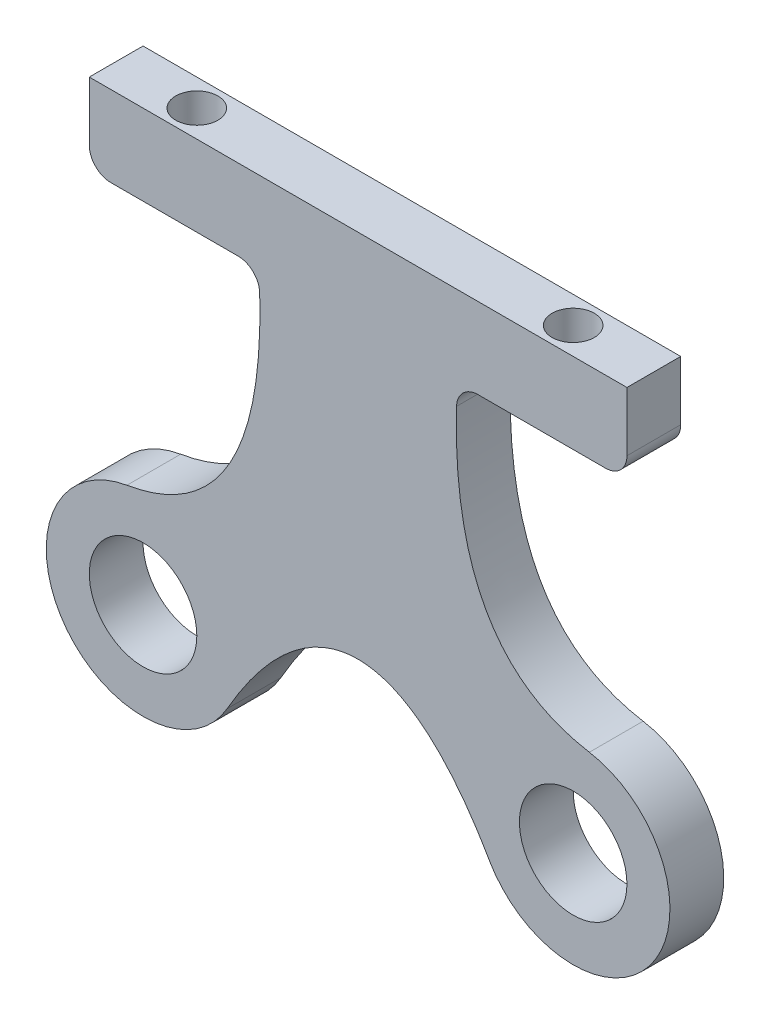
ISO-10303-21;
HEADER;
FILE_DESCRIPTION(('STEP AP214'),'2;1');
FILE_NAME('part.step','',(''),(''),'','','');
FILE_SCHEMA(('AUTOMOTIVE_DESIGN { 1 0 10303 214 1 1 1 1 }'));
ENDSEC;
DATA;
#1=APPLICATION_CONTEXT('core data for automotive mechanical design processes');
#2=APPLICATION_PROTOCOL_DEFINITION('international standard','automotive_design',2000,#1);
#3=PRODUCT_CONTEXT('',#1,'mechanical');
#4=PRODUCT('Part','Part','',(#3));
#5=PRODUCT_RELATED_PRODUCT_CATEGORY('part','',(#4));
#6=PRODUCT_DEFINITION_FORMATION('','',#4);
#7=PRODUCT_DEFINITION_CONTEXT('part definition',#1,'design');
#8=PRODUCT_DEFINITION('design','',#6,#7);
#9=PRODUCT_DEFINITION_SHAPE('','',#8);
#10=(LENGTH_UNIT() NAMED_UNIT(*) SI_UNIT(.MILLI.,.METRE.));
#11=(NAMED_UNIT(*) PLANE_ANGLE_UNIT() SI_UNIT($,.RADIAN.));
#12=(NAMED_UNIT(*) SI_UNIT($,.STERADIAN.) SOLID_ANGLE_UNIT());
#13=UNCERTAINTY_MEASURE_WITH_UNIT(LENGTH_MEASURE(1.E-05),#10,'distance_accuracy_value','');
#14=(GEOMETRIC_REPRESENTATION_CONTEXT(3) GLOBAL_UNCERTAINTY_ASSIGNED_CONTEXT((#13)) GLOBAL_UNIT_ASSIGNED_CONTEXT((#10,
#11,#12)) REPRESENTATION_CONTEXT('',''));
#15=CARTESIAN_POINT('',(0.,0.,0.));
#16=DIRECTION('',(0.,0.,1.));
#17=DIRECTION('',(1.,0.,0.));
#18=AXIS2_PLACEMENT_3D('',#15,#16,#17);
#19=CARTESIAN_POINT('',(-15.4784384659952,-56.4751666695311,3.175));
#20=CARTESIAN_POINT('',(-5.06783039272914,-38.2749102506567,3.175));
#21=CARTESIAN_POINT('',(6.38081654035735,-40.5703270402513,3.175));
#22=CARTESIAN_POINT('',(15.4784384659952,-56.4751666695311,3.175));
#23=B_SPLINE_CURVE_WITH_KNOTS('',3,(#19,#20,#21,#22),.UNSPECIFIED.,.F.,.F.,(4,4),(0.,1.),.UNSPECIFIED.);
#24=DIRECTION('',(0.,0.,-1.));
#25=VECTOR('',#24,1.);
#26=SURFACE_OF_LINEAR_EXTRUSION('',#23,#25);
#27=CARTESIAN_POINT('',(-15.4784384659952,-56.4751666695311,-3.175));
#28=CARTESIAN_POINT('',(-5.06783039272914,-38.2749102506567,-3.175));
#29=CARTESIAN_POINT('',(6.38081654035735,-40.5703270402513,-3.175));
#30=CARTESIAN_POINT('',(15.4784384659952,-56.4751666695311,-3.175));
#31=B_SPLINE_CURVE_WITH_KNOTS('',3,(#27,#28,#29,#30),.UNSPECIFIED.,.F.,.F.,(4,4),(0.,1.),.UNSPECIFIED.);
#32=CARTESIAN_POINT('',(-15.4784384659952,-56.4751666695311,-3.175));
#33=VERTEX_POINT('',#32);
#34=CARTESIAN_POINT('',(15.4784384659952,-56.4751666695311,-3.175));
#35=VERTEX_POINT('',#34);
#36=EDGE_CURVE('E162',#33,#35,#31,.T.);
#37=ORIENTED_EDGE('',*,*,#36,.T.);
#38=DIRECTION('',(0.,0.,-1.));
#39=VECTOR('',#38,1.);
#40=CARTESIAN_POINT('',(15.4784384659952,-56.4751666695311,3.175));
#41=LINE('',#40,#39);
#42=CARTESIAN_POINT('',(15.4784384659952,-56.4751666695311,3.175));
#43=VERTEX_POINT('',#42);
#44=EDGE_CURVE('E141',#43,#35,#41,.T.);
#45=ORIENTED_EDGE('',*,*,#44,.F.);
#46=CARTESIAN_POINT('',(-15.4784384659952,-56.4751666695311,3.175));
#47=VERTEX_POINT('',#46);
#48=EDGE_CURVE('E148',#47,#43,#23,.T.);
#49=ORIENTED_EDGE('',*,*,#48,.F.);
#50=DIRECTION('',(0.,0.,-1.));
#51=VECTOR('',#50,1.);
#52=CARTESIAN_POINT('',(-15.4784384659952,-56.4751666695311,3.175));
#53=LINE('',#52,#51);
#54=EDGE_CURVE('E311',#47,#33,#53,.T.);
#55=ORIENTED_EDGE('',*,*,#54,.T.);
#56=EDGE_LOOP('',(#37,#45,#49,#55));
#57=FACE_BOUND('',#56,.T.);
#58=ADVANCED_FACE('F35',(#57),#26,.F.);
#59=CARTESIAN_POINT('',(25.4,-50.8,3.175));
#60=DIRECTION('',(0.,0.,-1.));
#61=DIRECTION('',(-1.,0.,0.));
#62=AXIS2_PLACEMENT_3D('',#59,#60,#61);
#63=CYLINDRICAL_SURFACE('',#62,11.43);
#64=CARTESIAN_POINT('',(25.4,-50.8,-3.175));
#65=DIRECTION('',(0.,0.,1.));
#66=DIRECTION('',(1.,0.,0.));
#67=AXIS2_PLACEMENT_3D('',#64,#65,#66);
#68=CIRCLE('',#67,11.43);
#69=CARTESIAN_POINT('',(27.3097126524474,-39.5306656103795,-3.175));
#70=VERTEX_POINT('',#69);
#71=EDGE_CURVE('E327',#35,#70,#68,.T.);
#72=ORIENTED_EDGE('',*,*,#71,.T.);
#73=DIRECTION('',(0.,0.,-1.));
#74=VECTOR('',#73,1.);
#75=CARTESIAN_POINT('',(27.3097126524474,-39.5306656103795,3.175));
#76=LINE('',#75,#74);
#77=CARTESIAN_POINT('',(27.3097126524474,-39.5306656103795,3.175));
#78=VERTEX_POINT('',#77);
#79=EDGE_CURVE('E144',#78,#70,#76,.T.);
#80=ORIENTED_EDGE('',*,*,#79,.F.);
#81=CARTESIAN_POINT('',(25.4,-50.8,3.175));
#82=DIRECTION('',(0.,0.,1.));
#83=DIRECTION('',(1.,0.,0.));
#84=AXIS2_PLACEMENT_3D('',#81,#82,#83);
#85=CIRCLE('',#84,11.43);
#86=EDGE_CURVE('E137',#43,#78,#85,.T.);
#87=ORIENTED_EDGE('',*,*,#86,.F.);
#88=ORIENTED_EDGE('',*,*,#44,.T.);
#89=EDGE_LOOP('',(#72,#80,#87,#88));
#90=FACE_BOUND('',#89,.T.);
#91=ADVANCED_FACE('F139',(#90),#63,.T.);
#92=CARTESIAN_POINT('',(27.3097126524474,-39.5306656103795,3.175));
#93=CARTESIAN_POINT('',(10.1214415846719,-36.6179240413602,3.175));
#94=CARTESIAN_POINT('',(11.7360703680007,-9.52500000000001,3.175));
#95=B_SPLINE_CURVE_WITH_KNOTS('',2,(#92,#93,#94),.UNSPECIFIED.,.F.,.F.,(3,3),(0.,1.),.UNSPECIFIED.);
#96=DIRECTION('',(0.,0.,-1.));
#97=VECTOR('',#96,1.);
#98=SURFACE_OF_LINEAR_EXTRUSION('',#95,#97);
#99=CARTESIAN_POINT('',(27.3097126524474,-39.5306656103795,-3.175));
#100=CARTESIAN_POINT('',(10.1214415846719,-36.6179240413602,-3.175));
#101=CARTESIAN_POINT('',(11.7360703680007,-9.52500000000001,-3.175));
#102=B_SPLINE_CURVE_WITH_KNOTS('',2,(#99,#100,#101),.UNSPECIFIED.,.F.,.F.,(3,3),(0.,1.),.UNSPECIFIED.);
#103=CARTESIAN_POINT('',(11.6265587163297,-11.9926300390394,-3.175));
#104=VERTEX_POINT('',#103);
#105=EDGE_CURVE('E320',#70,#104,#102,.T.);
#106=ORIENTED_EDGE('',*,*,#105,.T.);
#107=DIRECTION('',(0.,0.,-1.));
#108=VECTOR('',#107,1.);
#109=CARTESIAN_POINT('',(11.6265587163297,-11.9926300390394,-3.175));
#110=LINE('',#109,#108);
#111=CARTESIAN_POINT('',(11.6265587163297,-11.9926300390394,3.175));
#112=VERTEX_POINT('',#111);
#113=EDGE_CURVE('E190',#104,#112,#110,.F.);
#114=ORIENTED_EDGE('',*,*,#113,.T.);
#115=EDGE_CURVE('E147',#78,#112,#95,.T.);
#116=ORIENTED_EDGE('',*,*,#115,.F.);
#117=ORIENTED_EDGE('',*,*,#79,.T.);
#118=EDGE_LOOP('',(#106,#114,#116,#117));
#119=FACE_BOUND('',#118,.T.);
#120=ADVANCED_FACE('F257',(#119),#98,.F.);
#121=CARTESIAN_POINT('',(0.,-9.52500000000001,3.175));
#122=DIRECTION('',(0.,-1.,0.));
#123=DIRECTION('',(0.,0.,-1.));
#124=AXIS2_PLACEMENT_3D('',#121,#122,#123);
#125=PLANE('',#124);
#126=CARTESIAN_POINT('',(22.225,-9.52500000000001,0.));
#127=DIRECTION('',(0.,-1.,0.));
#128=DIRECTION('',(0.,0.,-1.));
#129=AXIS2_PLACEMENT_3D('',#126,#127,#128);
#130=CIRCLE('',#129,2.4892);
#131=CARTESIAN_POINT('',(22.225,-9.52500000000001,-2.48919999999999));
#132=VERTEX_POINT('',#131);
#133=EDGE_CURVE('E377',#132,#132,#130,.T.);
#134=ORIENTED_EDGE('',*,*,#133,.F.);
#135=EDGE_LOOP('',(#134));
#136=FACE_BOUND('',#135,.T.);
#137=DIRECTION('',(-1.,0.,0.));
#138=VECTOR('',#137,1.);
#139=CARTESIAN_POINT('',(0.,-9.52500000000001,-3.175));
#140=LINE('',#139,#138);
#141=CARTESIAN_POINT('',(29.21,-9.52500000000001,-3.175));
#142=VERTEX_POINT('',#141);
#143=CARTESIAN_POINT('',(14.1655275205395,-9.52500000000001,-3.175));
#144=VERTEX_POINT('',#143);
#145=EDGE_CURVE('E318',#142,#144,#140,.T.);
#146=ORIENTED_EDGE('',*,*,#145,.F.);
#147=DIRECTION('',(0.,0.,-1.));
#148=VECTOR('',#147,1.);
#149=CARTESIAN_POINT('',(29.21,-9.52500000000001,3.175));
#150=LINE('',#149,#148);
#151=CARTESIAN_POINT('',(29.21,-9.52500000000001,3.175));
#152=VERTEX_POINT('',#151);
#153=EDGE_CURVE('E178',#142,#152,#150,.F.);
#154=ORIENTED_EDGE('',*,*,#153,.T.);
#155=DIRECTION('',(-1.,0.,0.));
#156=VECTOR('',#155,1.);
#157=CARTESIAN_POINT('',(0.,-9.52500000000001,3.175));
#158=LINE('',#157,#156);
#159=CARTESIAN_POINT('',(14.1655275205395,-9.52500000000001,3.175));
#160=VERTEX_POINT('',#159);
#161=EDGE_CURVE('E268',#152,#160,#158,.T.);
#162=ORIENTED_EDGE('',*,*,#161,.T.);
#163=DIRECTION('',(0.,0.,-1.));
#164=VECTOR('',#163,1.);
#165=CARTESIAN_POINT('',(14.1655275205395,-9.52500000000001,3.175));
#166=LINE('',#165,#164);
#167=EDGE_CURVE('E175',#160,#144,#166,.T.);
#168=ORIENTED_EDGE('',*,*,#167,.T.);
#169=EDGE_LOOP('',(#146,#154,#162,#168));
#170=FACE_BOUND('',#169,.T.);
#171=ADVANCED_FACE('F253',(#136,#170),#125,.T.);
#172=CARTESIAN_POINT('',(31.75,0.,3.175));
#173=DIRECTION('',(1.,0.,0.));
#174=DIRECTION('',(0.,0.,-1.));
#175=AXIS2_PLACEMENT_3D('',#172,#173,#174);
#176=PLANE('',#175);
#177=DIRECTION('',(0.,-1.,0.));
#178=VECTOR('',#177,1.);
#179=CARTESIAN_POINT('',(31.75,0.,3.175));
#180=LINE('',#179,#178);
#181=CARTESIAN_POINT('',(31.75,0.,3.175));
#182=VERTEX_POINT('',#181);
#183=CARTESIAN_POINT('',(31.75,-6.98500000000001,3.175));
#184=VERTEX_POINT('',#183);
#185=EDGE_CURVE('E274',#182,#184,#180,.T.);
#186=ORIENTED_EDGE('',*,*,#185,.T.);
#187=DIRECTION('',(0.,0.,-1.));
#188=VECTOR('',#187,1.);
#189=CARTESIAN_POINT('',(31.75,-6.98500000000001,3.175));
#190=LINE('',#189,#188);
#191=CARTESIAN_POINT('',(31.75,-6.98500000000001,-3.175));
#192=VERTEX_POINT('',#191);
#193=EDGE_CURVE('E163',#184,#192,#190,.T.);
#194=ORIENTED_EDGE('',*,*,#193,.T.);
#195=DIRECTION('',(0.,-1.,0.));
#196=VECTOR('',#195,1.);
#197=CARTESIAN_POINT('',(31.75,0.,-3.175));
#198=LINE('',#197,#196);
#199=CARTESIAN_POINT('',(31.75,0.,-3.175));
#200=VERTEX_POINT('',#199);
#201=EDGE_CURVE('E294',#200,#192,#198,.T.);
#202=ORIENTED_EDGE('',*,*,#201,.F.);
#203=DIRECTION('',(0.,0.,-1.));
#204=VECTOR('',#203,1.);
#205=CARTESIAN_POINT('',(31.75,0.,3.175));
#206=LINE('',#205,#204);
#207=EDGE_CURVE('E168',#182,#200,#206,.T.);
#208=ORIENTED_EDGE('',*,*,#207,.F.);
#209=EDGE_LOOP('',(#186,#194,#202,#208));
#210=FACE_BOUND('',#209,.T.);
#211=ADVANCED_FACE('F249',(#210),#176,.T.);
#212=CARTESIAN_POINT('',(0.,0.,3.175));
#213=DIRECTION('',(0.,-1.,0.));
#214=DIRECTION('',(0.,0.,-1.));
#215=AXIS2_PLACEMENT_3D('',#212,#213,#214);
#216=PLANE('',#215);
#217=CARTESIAN_POINT('',(-22.225,0.,0.));
#218=DIRECTION('',(0.,-1.,0.));
#219=DIRECTION('',(0.,0.,-1.));
#220=AXIS2_PLACEMENT_3D('',#217,#218,#219);
#221=CIRCLE('',#220,2.48919999999999);
#222=CARTESIAN_POINT('',(-22.225,0.,-2.48919999999999));
#223=VERTEX_POINT('',#222);
#224=EDGE_CURVE('E380',#223,#223,#221,.T.);
#225=ORIENTED_EDGE('',*,*,#224,.T.);
#226=EDGE_LOOP('',(#225));
#227=FACE_BOUND('',#226,.T.);
#228=CARTESIAN_POINT('',(22.225,0.,0.));
#229=DIRECTION('',(0.,-1.,0.));
#230=DIRECTION('',(0.,0.,-1.));
#231=AXIS2_PLACEMENT_3D('',#228,#229,#230);
#232=CIRCLE('',#231,2.48919999999999);
#233=CARTESIAN_POINT('',(22.225,0.,-2.48919999999999));
#234=VERTEX_POINT('',#233);
#235=EDGE_CURVE('E335',#234,#234,#232,.T.);
#236=ORIENTED_EDGE('',*,*,#235,.T.);
#237=EDGE_LOOP('',(#236));
#238=FACE_BOUND('',#237,.T.);
#239=DIRECTION('',(-1.,0.,0.));
#240=VECTOR('',#239,1.);
#241=CARTESIAN_POINT('',(0.,0.,-3.175));
#242=LINE('',#241,#240);
#243=CARTESIAN_POINT('',(-31.75,0.,-3.175));
#244=VERTEX_POINT('',#243);
#245=EDGE_CURVE('E292',#200,#244,#242,.T.);
#246=ORIENTED_EDGE('',*,*,#245,.T.);
#247=DIRECTION('',(0.,0.,-1.));
#248=VECTOR('',#247,1.);
#249=CARTESIAN_POINT('',(-31.75,0.,3.175));
#250=LINE('',#249,#248);
#251=CARTESIAN_POINT('',(-31.75,0.,3.175));
#252=VERTEX_POINT('',#251);
#253=EDGE_CURVE('E291',#252,#244,#250,.T.);
#254=ORIENTED_EDGE('',*,*,#253,.F.);
#255=DIRECTION('',(-1.,0.,0.));
#256=VECTOR('',#255,1.);
#257=CARTESIAN_POINT('',(0.,0.,3.175));
#258=LINE('',#257,#256);
#259=EDGE_CURVE('E277',#182,#252,#258,.T.);
#260=ORIENTED_EDGE('',*,*,#259,.F.);
#261=ORIENTED_EDGE('',*,*,#207,.T.);
#262=EDGE_LOOP('',(#246,#254,#260,#261));
#263=FACE_BOUND('',#262,.T.);
#264=ADVANCED_FACE('F245',(#227,#238,#263),#216,.F.);
#265=CARTESIAN_POINT('',(-31.75,0.,3.175));
#266=DIRECTION('',(1.,0.,0.));
#267=DIRECTION('',(0.,0.,-1.));
#268=AXIS2_PLACEMENT_3D('',#265,#266,#267);
#269=PLANE('',#268);
#270=DIRECTION('',(0.,-1.,0.));
#271=VECTOR('',#270,1.);
#272=CARTESIAN_POINT('',(-31.75,0.,-3.175));
#273=LINE('',#272,#271);
#274=CARTESIAN_POINT('',(-31.75,-6.98500000000001,-3.175));
#275=VERTEX_POINT('',#274);
#276=EDGE_CURVE('E212',#244,#275,#273,.T.);
#277=ORIENTED_EDGE('',*,*,#276,.T.);
#278=DIRECTION('',(0.,0.,-1.));
#279=VECTOR('',#278,1.);
#280=CARTESIAN_POINT('',(-31.75,-6.98500000000001,3.175));
#281=LINE('',#280,#279);
#282=CARTESIAN_POINT('',(-31.75,-6.98500000000001,3.175));
#283=VERTEX_POINT('',#282);
#284=EDGE_CURVE('E188',#275,#283,#281,.F.);
#285=ORIENTED_EDGE('',*,*,#284,.T.);
#286=DIRECTION('',(0.,-1.,0.));
#287=VECTOR('',#286,1.);
#288=CARTESIAN_POINT('',(-31.75,0.,3.175));
#289=LINE('',#288,#287);
#290=EDGE_CURVE('E222',#252,#283,#289,.T.);
#291=ORIENTED_EDGE('',*,*,#290,.F.);
#292=ORIENTED_EDGE('',*,*,#253,.T.);
#293=EDGE_LOOP('',(#277,#285,#291,#292));
#294=FACE_BOUND('',#293,.T.);
#295=ADVANCED_FACE('F241',(#294),#269,.F.);
#296=CARTESIAN_POINT('',(0.,-9.52500000000001,3.175));
#297=DIRECTION('',(0.,1.,0.));
#298=DIRECTION('',(0.,0.,1.));
#299=AXIS2_PLACEMENT_3D('',#296,#297,#298);
#300=PLANE('',#299);
#301=CARTESIAN_POINT('',(-22.225,-9.52500000000001,0.));
#302=DIRECTION('',(0.,-1.,0.));
#303=DIRECTION('',(0.,0.,-1.));
#304=AXIS2_PLACEMENT_3D('',#301,#302,#303);
#305=CIRCLE('',#304,2.4892);
#306=CARTESIAN_POINT('',(-22.225,-9.52500000000001,-2.48919999999999));
#307=VERTEX_POINT('',#306);
#308=EDGE_CURVE('E383',#307,#307,#305,.T.);
#309=ORIENTED_EDGE('',*,*,#308,.F.);
#310=EDGE_LOOP('',(#309));
#311=FACE_BOUND('',#310,.T.);
#312=DIRECTION('',(1.,0.,0.));
#313=VECTOR('',#312,1.);
#314=CARTESIAN_POINT('',(0.,-9.52500000000001,3.175));
#315=LINE('',#314,#313);
#316=CARTESIAN_POINT('',(-29.21,-9.52500000000001,3.175));
#317=VERTEX_POINT('',#316);
#318=CARTESIAN_POINT('',(-14.1655275205395,-9.52500000000001,3.175));
#319=VERTEX_POINT('',#318);
#320=EDGE_CURVE('E218',#317,#319,#315,.T.);
#321=ORIENTED_EDGE('',*,*,#320,.F.);
#322=DIRECTION('',(0.,0.,-1.));
#323=VECTOR('',#322,1.);
#324=CARTESIAN_POINT('',(-29.21,-9.52500000000001,3.175));
#325=LINE('',#324,#323);
#326=CARTESIAN_POINT('',(-29.21,-9.52500000000001,-3.175));
#327=VERTEX_POINT('',#326);
#328=EDGE_CURVE('E185',#317,#327,#325,.T.);
#329=ORIENTED_EDGE('',*,*,#328,.T.);
#330=DIRECTION('',(1.,0.,0.));
#331=VECTOR('',#330,1.);
#332=CARTESIAN_POINT('',(0.,-9.52500000000001,-3.175));
#333=LINE('',#332,#331);
#334=CARTESIAN_POINT('',(-14.1655275205395,-9.52500000000001,-3.175));
#335=VERTEX_POINT('',#334);
#336=EDGE_CURVE('E204',#327,#335,#333,.T.);
#337=ORIENTED_EDGE('',*,*,#336,.T.);
#338=DIRECTION('',(0.,0.,-1.));
#339=VECTOR('',#338,1.);
#340=CARTESIAN_POINT('',(-14.1655275205395,-9.52500000000001,3.175));
#341=LINE('',#340,#339);
#342=EDGE_CURVE('E56',#335,#319,#341,.F.);
#343=ORIENTED_EDGE('',*,*,#342,.T.);
#344=EDGE_LOOP('',(#321,#329,#337,#343));
#345=FACE_BOUND('',#344,.T.);
#346=ADVANCED_FACE('F210',(#311,#345),#300,.F.);
#347=CARTESIAN_POINT('',(-27.3097126524474,-39.5306656103795,3.175));
#348=CARTESIAN_POINT('',(-10.1214415846719,-36.6179240413602,3.175));
#349=CARTESIAN_POINT('',(-11.7360703680007,-9.52500000000001,3.175));
#350=B_SPLINE_CURVE_WITH_KNOTS('',2,(#347,#348,#349),.UNSPECIFIED.,.F.,.F.,(3,3),(0.,1.),.UNSPECIFIED.);
#351=DIRECTION('',(0.,0.,-1.));
#352=VECTOR('',#351,1.);
#353=SURFACE_OF_LINEAR_EXTRUSION('',#350,#352);
#354=CARTESIAN_POINT('',(-27.3097126524474,-39.5306656103795,3.175));
#355=VERTEX_POINT('',#354);
#356=CARTESIAN_POINT('',(-11.6265587163297,-11.9926300390394,3.175));
#357=VERTEX_POINT('',#356);
#358=EDGE_CURVE('E216',#355,#357,#350,.T.);
#359=ORIENTED_EDGE('',*,*,#358,.T.);
#360=DIRECTION('',(0.,0.,-1.));
#361=VECTOR('',#360,1.);
#362=CARTESIAN_POINT('',(-11.6265587163297,-11.9926300390394,3.175));
#363=LINE('',#362,#361);
#364=CARTESIAN_POINT('',(-11.6265587163297,-11.9926300390394,-3.175));
#365=VERTEX_POINT('',#364);
#366=EDGE_CURVE('E192',#357,#365,#363,.T.);
#367=ORIENTED_EDGE('',*,*,#366,.T.);
#368=CARTESIAN_POINT('',(-27.3097126524474,-39.5306656103795,-3.175));
#369=CARTESIAN_POINT('',(-10.1214415846719,-36.6179240413602,-3.175));
#370=CARTESIAN_POINT('',(-11.7360703680007,-9.52500000000001,-3.175));
#371=B_SPLINE_CURVE_WITH_KNOTS('',2,(#368,#369,#370),.UNSPECIFIED.,.F.,.F.,(3,3),(0.,1.),.UNSPECIFIED.);
#372=CARTESIAN_POINT('',(-27.3097126524474,-39.5306656103795,-3.175));
#373=VERTEX_POINT('',#372);
#374=EDGE_CURVE('E207',#373,#365,#371,.T.);
#375=ORIENTED_EDGE('',*,*,#374,.F.);
#376=DIRECTION('',(0.,0.,-1.));
#377=VECTOR('',#376,1.);
#378=CARTESIAN_POINT('',(-27.3097126524474,-39.5306656103795,3.175));
#379=LINE('',#378,#377);
#380=EDGE_CURVE('E217',#355,#373,#379,.T.);
#381=ORIENTED_EDGE('',*,*,#380,.F.);
#382=EDGE_LOOP('',(#359,#367,#375,#381));
#383=FACE_BOUND('',#382,.T.);
#384=ADVANCED_FACE('F215',(#383),#353,.T.);
#385=CARTESIAN_POINT('',(-25.4,-50.8,3.175));
#386=DIRECTION('',(0.,0.,-1.));
#387=DIRECTION('',(-1.,0.,0.));
#388=AXIS2_PLACEMENT_3D('',#385,#386,#387);
#389=CYLINDRICAL_SURFACE('',#388,6.35);
#390=CARTESIAN_POINT('',(-25.4,-50.8,3.175));
#391=DIRECTION('',(0.,0.,1.));
#392=DIRECTION('',(1.,0.,0.));
#393=AXIS2_PLACEMENT_3D('',#390,#391,#392);
#394=CIRCLE('',#393,6.35);
#395=CARTESIAN_POINT('',(-19.05,-50.8,3.175));
#396=VERTEX_POINT('',#395);
#397=EDGE_CURVE('E220',#396,#396,#394,.T.);
#398=ORIENTED_EDGE('',*,*,#397,.T.);
#399=EDGE_LOOP('',(#398));
#400=FACE_BOUND('',#399,.T.);
#401=CARTESIAN_POINT('',(-25.4,-50.8,-3.175));
#402=DIRECTION('',(0.,0.,1.));
#403=DIRECTION('',(1.,0.,0.));
#404=AXIS2_PLACEMENT_3D('',#401,#402,#403);
#405=CIRCLE('',#404,6.35);
#406=CARTESIAN_POINT('',(-19.05,-50.8,-3.175));
#407=VERTEX_POINT('',#406);
#408=EDGE_CURVE('E306',#407,#407,#405,.T.);
#409=ORIENTED_EDGE('',*,*,#408,.F.);
#410=EDGE_LOOP('',(#409));
#411=FACE_BOUND('',#410,.T.);
#412=ADVANCED_FACE('F236',(#400,#411),#389,.F.);
#413=CARTESIAN_POINT('',(-25.4,-50.8,3.175));
#414=DIRECTION('',(0.,0.,-1.));
#415=DIRECTION('',(-1.,0.,0.));
#416=AXIS2_PLACEMENT_3D('',#413,#414,#415);
#417=CYLINDRICAL_SURFACE('',#416,11.43);
#418=CARTESIAN_POINT('',(-25.4,-50.8,-3.175));
#419=DIRECTION('',(0.,0.,1.));
#420=DIRECTION('',(1.,0.,0.));
#421=AXIS2_PLACEMENT_3D('',#418,#419,#420);
#422=CIRCLE('',#421,11.43);
#423=EDGE_CURVE('E301',#373,#33,#422,.T.);
#424=ORIENTED_EDGE('',*,*,#423,.T.);
#425=ORIENTED_EDGE('',*,*,#54,.F.);
#426=CARTESIAN_POINT('',(-25.4,-50.8,3.175));
#427=DIRECTION('',(0.,0.,1.));
#428=DIRECTION('',(1.,0.,0.));
#429=AXIS2_PLACEMENT_3D('',#426,#427,#428);
#430=CIRCLE('',#429,11.43);
#431=EDGE_CURVE('E155',#355,#47,#430,.T.);
#432=ORIENTED_EDGE('',*,*,#431,.F.);
#433=ORIENTED_EDGE('',*,*,#380,.T.);
#434=EDGE_LOOP('',(#424,#425,#432,#433));
#435=FACE_BOUND('',#434,.T.);
#436=ADVANCED_FACE('F237',(#435),#417,.T.);
#437=CARTESIAN_POINT('',(25.4,-50.8,3.175));
#438=DIRECTION('',(0.,0.,-1.));
#439=DIRECTION('',(-1.,0.,0.));
#440=AXIS2_PLACEMENT_3D('',#437,#438,#439);
#441=CYLINDRICAL_SURFACE('',#440,6.35);
#442=CARTESIAN_POINT('',(25.4,-50.8,3.175));
#443=DIRECTION('',(0.,0.,1.));
#444=DIRECTION('',(1.,0.,0.));
#445=AXIS2_PLACEMENT_3D('',#442,#443,#444);
#446=CIRCLE('',#445,6.35);
#447=CARTESIAN_POINT('',(31.75,-50.8,3.175));
#448=VERTEX_POINT('',#447);
#449=EDGE_CURVE('E313',#448,#448,#446,.T.);
#450=ORIENTED_EDGE('',*,*,#449,.T.);
#451=EDGE_LOOP('',(#450));
#452=FACE_BOUND('',#451,.T.);
#453=CARTESIAN_POINT('',(25.4,-50.8,-3.175));
#454=DIRECTION('',(0.,0.,1.));
#455=DIRECTION('',(1.,0.,0.));
#456=AXIS2_PLACEMENT_3D('',#453,#454,#455);
#457=CIRCLE('',#456,6.35);
#458=CARTESIAN_POINT('',(31.75,-50.8,-3.175));
#459=VERTEX_POINT('',#458);
#460=EDGE_CURVE('E159',#459,#459,#457,.T.);
#461=ORIENTED_EDGE('',*,*,#460,.F.);
#462=EDGE_LOOP('',(#461));
#463=FACE_BOUND('',#462,.T.);
#464=ADVANCED_FACE('F346',(#452,#463),#441,.F.);
#465=CARTESIAN_POINT('',(0.,0.,3.175));
#466=DIRECTION('',(0.,0.,1.));
#467=DIRECTION('',(1.,0.,0.));
#468=AXIS2_PLACEMENT_3D('',#465,#466,#467);
#469=PLANE('',#468);
#470=ORIENTED_EDGE('',*,*,#161,.F.);
#471=CARTESIAN_POINT('',(29.21,-6.98500000000001,3.175));
#472=DIRECTION('',(0.,0.,1.));
#473=DIRECTION('',(1.,0.,0.));
#474=AXIS2_PLACEMENT_3D('',#471,#472,#473);
#475=CIRCLE('',#474,2.54);
#476=EDGE_CURVE('E182',#152,#184,#475,.T.);
#477=ORIENTED_EDGE('',*,*,#476,.T.);
#478=ORIENTED_EDGE('',*,*,#185,.F.);
#479=ORIENTED_EDGE('',*,*,#259,.T.);
#480=ORIENTED_EDGE('',*,*,#290,.T.);
#481=CARTESIAN_POINT('',(-29.21,-6.98500000000001,3.175));
#482=DIRECTION('',(0.,0.,1.));
#483=DIRECTION('',(1.,0.,0.));
#484=AXIS2_PLACEMENT_3D('',#481,#482,#483);
#485=CIRCLE('',#484,2.54);
#486=EDGE_CURVE('E180',#283,#317,#485,.T.);
#487=ORIENTED_EDGE('',*,*,#486,.T.);
#488=ORIENTED_EDGE('',*,*,#320,.T.);
#489=CARTESIAN_POINT('',(-14.1655275205395,-12.065,3.175));
#490=DIRECTION('',(0.,0.,1.));
#491=DIRECTION('',(1.,0.,0.));
#492=AXIS2_PLACEMENT_3D('',#489,#490,#491);
#493=CIRCLE('',#492,2.54);
#494=EDGE_CURVE('E11',#319,#357,#493,.F.);
#495=ORIENTED_EDGE('',*,*,#494,.T.);
#496=ORIENTED_EDGE('',*,*,#358,.F.);
#497=ORIENTED_EDGE('',*,*,#431,.T.);
#498=ORIENTED_EDGE('',*,*,#48,.T.);
#499=ORIENTED_EDGE('',*,*,#86,.T.);
#500=ORIENTED_EDGE('',*,*,#115,.T.);
#501=CARTESIAN_POINT('',(14.1655275205395,-12.065,3.175));
#502=DIRECTION('',(0.,0.,1.));
#503=DIRECTION('',(1.,0.,0.));
#504=AXIS2_PLACEMENT_3D('',#501,#502,#503);
#505=CIRCLE('',#504,2.54);
#506=EDGE_CURVE('E197',#112,#160,#505,.F.);
#507=ORIENTED_EDGE('',*,*,#506,.T.);
#508=EDGE_LOOP('',(#470,#477,#478,#479,#480,#487,#488,#495,#496,#497,#498,#499,#500,#507));
#509=FACE_BOUND('',#508,.T.);
#510=ORIENTED_EDGE('',*,*,#397,.F.);
#511=EDGE_LOOP('',(#510));
#512=FACE_BOUND('',#511,.T.);
#513=ORIENTED_EDGE('',*,*,#449,.F.);
#514=EDGE_LOOP('',(#513));
#515=FACE_BOUND('',#514,.T.);
#516=ADVANCED_FACE('F152',(#509,#512,#515),#469,.T.);
#517=CARTESIAN_POINT('',(0.,0.,-3.175));
#518=DIRECTION('',(0.,0.,1.));
#519=DIRECTION('',(1.,0.,0.));
#520=AXIS2_PLACEMENT_3D('',#517,#518,#519);
#521=PLANE('',#520);
#522=ORIENTED_EDGE('',*,*,#201,.T.);
#523=CARTESIAN_POINT('',(29.21,-6.98500000000001,-3.175));
#524=DIRECTION('',(0.,0.,1.));
#525=DIRECTION('',(1.,0.,0.));
#526=AXIS2_PLACEMENT_3D('',#523,#524,#525);
#527=CIRCLE('',#526,2.54);
#528=EDGE_CURVE('E173',#192,#142,#527,.F.);
#529=ORIENTED_EDGE('',*,*,#528,.T.);
#530=ORIENTED_EDGE('',*,*,#145,.T.);
#531=CARTESIAN_POINT('',(14.1655275205395,-12.065,-3.175));
#532=DIRECTION('',(0.,0.,1.));
#533=DIRECTION('',(1.,0.,0.));
#534=AXIS2_PLACEMENT_3D('',#531,#532,#533);
#535=CIRCLE('',#534,2.54);
#536=EDGE_CURVE('E195',#144,#104,#535,.T.);
#537=ORIENTED_EDGE('',*,*,#536,.T.);
#538=ORIENTED_EDGE('',*,*,#105,.F.);
#539=ORIENTED_EDGE('',*,*,#71,.F.);
#540=ORIENTED_EDGE('',*,*,#36,.F.);
#541=ORIENTED_EDGE('',*,*,#423,.F.);
#542=ORIENTED_EDGE('',*,*,#374,.T.);
#543=CARTESIAN_POINT('',(-14.1655275205395,-12.065,-3.175));
#544=DIRECTION('',(0.,0.,1.));
#545=DIRECTION('',(1.,0.,0.));
#546=AXIS2_PLACEMENT_3D('',#543,#544,#545);
#547=CIRCLE('',#546,2.54);
#548=EDGE_CURVE('E43',#365,#335,#547,.T.);
#549=ORIENTED_EDGE('',*,*,#548,.T.);
#550=ORIENTED_EDGE('',*,*,#336,.F.);
#551=CARTESIAN_POINT('',(-29.21,-6.98500000000001,-3.175));
#552=DIRECTION('',(0.,0.,1.));
#553=DIRECTION('',(1.,0.,0.));
#554=AXIS2_PLACEMENT_3D('',#551,#552,#553);
#555=CIRCLE('',#554,2.54);
#556=EDGE_CURVE('E166',#327,#275,#555,.F.);
#557=ORIENTED_EDGE('',*,*,#556,.T.);
#558=ORIENTED_EDGE('',*,*,#276,.F.);
#559=ORIENTED_EDGE('',*,*,#245,.F.);
#560=EDGE_LOOP('',(#522,#529,#530,#537,#538,#539,#540,#541,#542,#549,#550,#557,#558,#559));
#561=FACE_BOUND('',#560,.T.);
#562=ORIENTED_EDGE('',*,*,#408,.T.);
#563=EDGE_LOOP('',(#562));
#564=FACE_BOUND('',#563,.T.);
#565=ORIENTED_EDGE('',*,*,#460,.T.);
#566=EDGE_LOOP('',(#565));
#567=FACE_BOUND('',#566,.T.);
#568=ADVANCED_FACE('F202',(#561,#564,#567),#521,.F.);
#569=CARTESIAN_POINT('',(29.21,-6.98500000000001,3.175));
#570=DIRECTION('',(0.,0.,-1.));
#571=DIRECTION('',(-1.,0.,0.));
#572=AXIS2_PLACEMENT_3D('',#569,#570,#571);
#573=CYLINDRICAL_SURFACE('',#572,2.54);
#574=ORIENTED_EDGE('',*,*,#476,.F.);
#575=ORIENTED_EDGE('',*,*,#153,.F.);
#576=ORIENTED_EDGE('',*,*,#528,.F.);
#577=ORIENTED_EDGE('',*,*,#193,.F.);
#578=EDGE_LOOP('',(#574,#575,#576,#577));
#579=FACE_BOUND('',#578,.T.);
#580=ADVANCED_FACE('F356',(#579),#573,.T.);
#581=CARTESIAN_POINT('',(-29.21,-6.98500000000001,3.175));
#582=DIRECTION('',(0.,0.,-1.));
#583=DIRECTION('',(-1.,0.,0.));
#584=AXIS2_PLACEMENT_3D('',#581,#582,#583);
#585=CYLINDRICAL_SURFACE('',#584,2.54);
#586=ORIENTED_EDGE('',*,*,#486,.F.);
#587=ORIENTED_EDGE('',*,*,#284,.F.);
#588=ORIENTED_EDGE('',*,*,#556,.F.);
#589=ORIENTED_EDGE('',*,*,#328,.F.);
#590=EDGE_LOOP('',(#586,#587,#588,#589));
#591=FACE_BOUND('',#590,.T.);
#592=ADVANCED_FACE('F287',(#591),#585,.T.);
#593=CARTESIAN_POINT('',(14.1655275205395,-12.065,0.));
#594=DIRECTION('',(0.,0.,-1.));
#595=DIRECTION('',(-1.,0.,0.));
#596=AXIS2_PLACEMENT_3D('',#593,#594,#595);
#597=CYLINDRICAL_SURFACE('',#596,2.54);
#598=ORIENTED_EDGE('',*,*,#506,.F.);
#599=ORIENTED_EDGE('',*,*,#113,.F.);
#600=ORIENTED_EDGE('',*,*,#536,.F.);
#601=ORIENTED_EDGE('',*,*,#167,.F.);
#602=EDGE_LOOP('',(#598,#599,#600,#601));
#603=FACE_BOUND('',#602,.T.);
#604=ADVANCED_FACE('F409',(#603),#597,.F.);
#605=CARTESIAN_POINT('',(-14.1655275205395,-12.065,0.));
#606=DIRECTION('',(0.,0.,-1.));
#607=DIRECTION('',(-1.,0.,0.));
#608=AXIS2_PLACEMENT_3D('',#605,#606,#607);
#609=CYLINDRICAL_SURFACE('',#608,2.54);
#610=ORIENTED_EDGE('',*,*,#494,.F.);
#611=ORIENTED_EDGE('',*,*,#342,.F.);
#612=ORIENTED_EDGE('',*,*,#548,.F.);
#613=ORIENTED_EDGE('',*,*,#366,.F.);
#614=EDGE_LOOP('',(#610,#611,#612,#613));
#615=FACE_BOUND('',#614,.T.);
#616=ADVANCED_FACE('F37',(#615),#609,.F.);
#617=CARTESIAN_POINT('',(22.225,-9.52500000000001,0.));
#618=DIRECTION('',(0.,-1.,0.));
#619=DIRECTION('',(0.,0.,-1.));
#620=AXIS2_PLACEMENT_3D('',#617,#618,#619);
#621=CYLINDRICAL_SURFACE('',#620,2.4892);
#622=ORIENTED_EDGE('',*,*,#235,.F.);
#623=EDGE_LOOP('',(#622));
#624=FACE_BOUND('',#623,.T.);
#625=ORIENTED_EDGE('',*,*,#133,.T.);
#626=EDGE_LOOP('',(#625));
#627=FACE_BOUND('',#626,.T.);
#628=ADVANCED_FACE('F389',(#624,#627),#621,.F.);
#629=CARTESIAN_POINT('',(-22.225,-9.52500000000001,0.));
#630=DIRECTION('',(0.,-1.,0.));
#631=DIRECTION('',(0.,0.,-1.));
#632=AXIS2_PLACEMENT_3D('',#629,#630,#631);
#633=CYLINDRICAL_SURFACE('',#632,2.4892);
#634=ORIENTED_EDGE('',*,*,#224,.F.);
#635=EDGE_LOOP('',(#634));
#636=FACE_BOUND('',#635,.T.);
#637=ORIENTED_EDGE('',*,*,#308,.T.);
#638=EDGE_LOOP('',(#637));
#639=FACE_BOUND('',#638,.T.);
#640=ADVANCED_FACE('F387',(#636,#639),#633,.F.);
#641=CLOSED_SHELL('',(#58,#91,#120,#171,#211,#264,#295,#346,#384,#412,#436,#464,#516,#568,#580,
#592,#604,#616,#628,#640));
#642=MANIFOLD_SOLID_BREP('B2',#641);
#643=ADVANCED_BREP_SHAPE_REPRESENTATION('',(#18,#642),#14);
#644=SHAPE_DEFINITION_REPRESENTATION(#9,#643);
ENDSEC;
END-ISO-10303-21;
